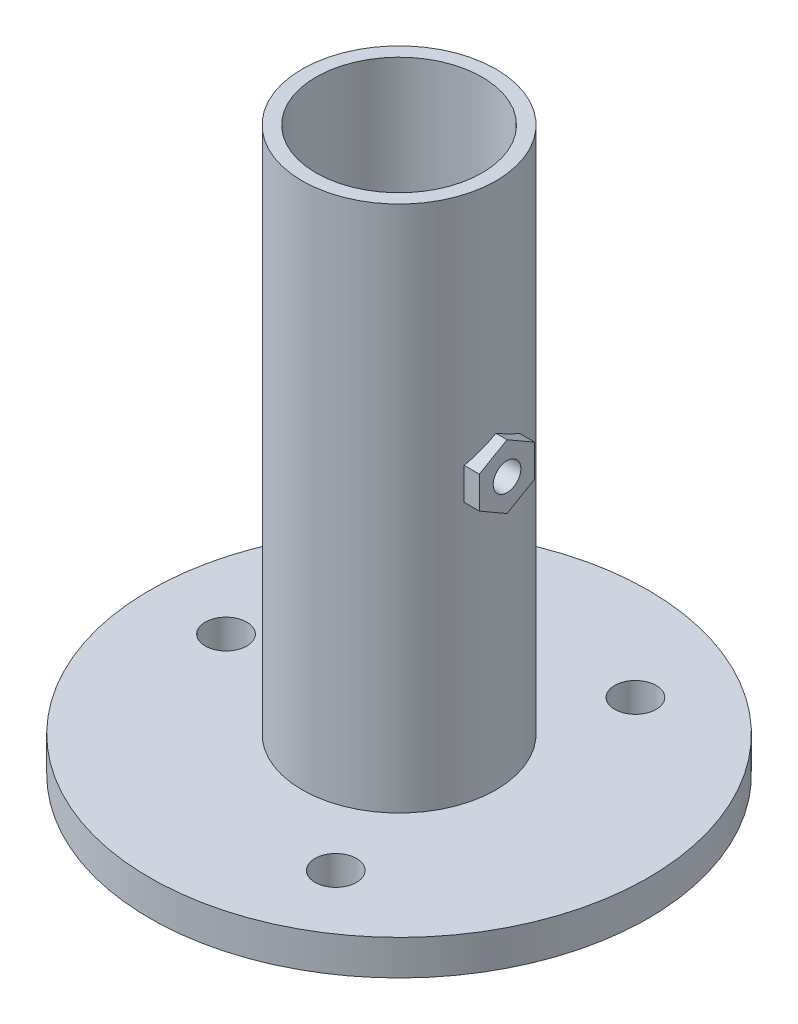
ISO-10303-21;
HEADER;
FILE_DESCRIPTION(('STEP AP214'),'2;1');
FILE_NAME('part.step','',(''),(''),'','','');
FILE_SCHEMA(('AUTOMOTIVE_DESIGN { 1 0 10303 214 1 1 1 1 }'));
ENDSEC;
DATA;
#1=APPLICATION_CONTEXT('core data for automotive mechanical design processes');
#2=APPLICATION_PROTOCOL_DEFINITION('international standard','automotive_design',2000,#1);
#3=PRODUCT_CONTEXT('',#1,'mechanical');
#4=PRODUCT('Part','Part','',(#3));
#5=PRODUCT_RELATED_PRODUCT_CATEGORY('part','',(#4));
#6=PRODUCT_DEFINITION_FORMATION('','',#4);
#7=PRODUCT_DEFINITION_CONTEXT('part definition',#1,'design');
#8=PRODUCT_DEFINITION('design','',#6,#7);
#9=PRODUCT_DEFINITION_SHAPE('','',#8);
#10=(LENGTH_UNIT() NAMED_UNIT(*) SI_UNIT(.MILLI.,.METRE.));
#11=(NAMED_UNIT(*) PLANE_ANGLE_UNIT() SI_UNIT($,.RADIAN.));
#12=(NAMED_UNIT(*) SI_UNIT($,.STERADIAN.) SOLID_ANGLE_UNIT());
#13=UNCERTAINTY_MEASURE_WITH_UNIT(LENGTH_MEASURE(1.E-05),#10,'distance_accuracy_value','');
#14=(GEOMETRIC_REPRESENTATION_CONTEXT(3) GLOBAL_UNCERTAINTY_ASSIGNED_CONTEXT((#13)) GLOBAL_UNIT_ASSIGNED_CONTEXT((#10,
#11,#12)) REPRESENTATION_CONTEXT('',''));
#15=CARTESIAN_POINT('',(0.,0.,0.));
#16=DIRECTION('',(0.,0.,1.));
#17=DIRECTION('',(1.,0.,0.));
#18=AXIS2_PLACEMENT_3D('',#15,#16,#17);
#19=CARTESIAN_POINT('',(0.,101.6,0.));
#20=DIRECTION('',(0.,-1.,0.));
#21=DIRECTION('',(0.,0.,-1.));
#22=AXIS2_PLACEMENT_3D('',#19,#20,#21);
#23=CYLINDRICAL_SURFACE('',#22,17.5);
#24=CARTESIAN_POINT('',(0.,62.1235026918963,0.));
#25=DIRECTION('',(0.,0.866025403784437,-0.500000000000003));
#26=DIRECTION('',(0.,-0.500000000000003,-0.866025403784437));
#27=AXIS2_PLACEMENT_3D('',#24,#25,#26);
#28=ELLIPSE('',#27,20.207259421637,17.5);
#29=CARTESIAN_POINT('',(17.5,62.1235026918963,0.));
#30=VERTEX_POINT('',#29);
#31=CARTESIAN_POINT('',(16.7705098312484,59.2367513459481,-5.00000000000001));
#32=VERTEX_POINT('',#31);
#33=EDGE_CURVE('E213',#30,#32,#28,.T.);
#34=ORIENTED_EDGE('',*,*,#33,.T.);
#35=DIRECTION('',(0.,-1.,0.));
#36=VECTOR('',#35,1.);
#37=CARTESIAN_POINT('',(16.7705098312484,101.6,-5.00000000000016));
#38=LINE('',#37,#36);
#39=CARTESIAN_POINT('',(16.7705098312484,53.4632486540519,-4.99999999999999));
#40=VERTEX_POINT('',#39);
#41=EDGE_CURVE('E216',#32,#40,#38,.T.);
#42=ORIENTED_EDGE('',*,*,#41,.T.);
#43=CARTESIAN_POINT('',(0.,50.5764973081038,0.));
#44=DIRECTION('',(0.,-0.86602540378444,-0.499999999999997));
#45=DIRECTION('',(0.,-0.499999999999997,0.86602540378444));
#46=AXIS2_PLACEMENT_3D('',#43,#44,#45);
#47=ELLIPSE('',#46,20.2072594216369,17.5);
#48=CARTESIAN_POINT('',(17.5,50.5764973081038,0.));
#49=VERTEX_POINT('',#48);
#50=EDGE_CURVE('E186',#40,#49,#47,.T.);
#51=ORIENTED_EDGE('',*,*,#50,.T.);
#52=CARTESIAN_POINT('',(0.,50.5764973081037,0.));
#53=DIRECTION('',(0.,-0.866025403784437,0.500000000000003));
#54=DIRECTION('',(0.,-0.500000000000003,-0.866025403784437));
#55=AXIS2_PLACEMENT_3D('',#52,#53,#54);
#56=ELLIPSE('',#55,20.2072594216369,17.5);
#57=CARTESIAN_POINT('',(16.7705098312484,53.4632486540519,5.));
#58=VERTEX_POINT('',#57);
#59=EDGE_CURVE('E204',#49,#58,#56,.T.);
#60=ORIENTED_EDGE('',*,*,#59,.T.);
#61=DIRECTION('',(0.,-1.,0.));
#62=VECTOR('',#61,1.);
#63=CARTESIAN_POINT('',(16.7705098312485,101.6,4.99999999999982));
#64=LINE('',#63,#62);
#65=CARTESIAN_POINT('',(16.7705098312485,59.2367513459482,4.99999999999998));
#66=VERTEX_POINT('',#65);
#67=EDGE_CURVE('E207',#58,#66,#64,.F.);
#68=ORIENTED_EDGE('',*,*,#67,.T.);
#69=CARTESIAN_POINT('',(0.,62.1235026918963,0.));
#70=DIRECTION('',(0.,0.86602540378444,0.499999999999997));
#71=DIRECTION('',(0.,-0.499999999999997,0.86602540378444));
#72=AXIS2_PLACEMENT_3D('',#69,#70,#71);
#73=ELLIPSE('',#72,20.2072594216369,17.5);
#74=EDGE_CURVE('E210',#66,#30,#73,.T.);
#75=ORIENTED_EDGE('',*,*,#74,.T.);
#76=EDGE_LOOP('',(#34,#42,#51,#60,#68,#75));
#77=FACE_BOUND('',#76,.T.);
#78=CARTESIAN_POINT('',(0.,101.6,0.));
#79=DIRECTION('',(0.,1.,0.));
#80=DIRECTION('',(0.,0.,1.));
#81=AXIS2_PLACEMENT_3D('',#78,#79,#80);
#82=CIRCLE('',#81,17.5);
#83=CARTESIAN_POINT('',(0.,101.6,17.5));
#84=VERTEX_POINT('',#83);
#85=EDGE_CURVE('E233',#84,#84,#82,.T.);
#86=ORIENTED_EDGE('',*,*,#85,.F.);
#87=EDGE_LOOP('',(#86));
#88=FACE_BOUND('',#87,.T.);
#89=CARTESIAN_POINT('',(0.,6.34999999999999,0.));
#90=DIRECTION('',(0.,-1.,0.));
#91=DIRECTION('',(0.,0.,-1.));
#92=AXIS2_PLACEMENT_3D('',#89,#90,#91);
#93=CIRCLE('',#92,17.5);
#94=CARTESIAN_POINT('',(0.,6.34999999999999,-17.5));
#95=VERTEX_POINT('',#94);
#96=EDGE_CURVE('E238',#95,#95,#93,.T.);
#97=ORIENTED_EDGE('',*,*,#96,.F.);
#98=EDGE_LOOP('',(#97));
#99=FACE_BOUND('',#98,.T.);
#100=ADVANCED_FACE('F39',(#77,#88,#99),#23,.T.);
#101=CARTESIAN_POINT('',(0.,-42.4264067919965,0.));
#102=DIRECTION('',(0.,1.,0.));
#103=DIRECTION('',(0.,0.,1.));
#104=AXIS2_PLACEMENT_3D('',#101,#102,#103);
#105=CYLINDRICAL_SURFACE('',#104,14.9999999719999);
#106=CARTESIAN_POINT('',(0.,50.5764973081038,0.));
#107=DIRECTION('',(0.,-0.86602540378444,-0.499999999999997));
#108=DIRECTION('',(0.,0.499999999999997,-0.86602540378444));
#109=AXIS2_PLACEMENT_3D('',#106,#107,#108);
#110=ELLIPSE('',#109,17.320508043357,14.9999999719999);
#111=CARTESIAN_POINT('',(14.9999999719999,50.5764973081038,0.));
#112=VERTEX_POINT('',#111);
#113=CARTESIAN_POINT('',(14.1421355940323,53.4632486540519,-4.99999999999999));
#114=VERTEX_POINT('',#113);
#115=EDGE_CURVE('E241',#112,#114,#110,.F.);
#116=ORIENTED_EDGE('',*,*,#115,.T.);
#117=DIRECTION('',(0.,1.,0.));
#118=VECTOR('',#117,1.);
#119=CARTESIAN_POINT('',(14.1421355940324,-42.4264067919965,-4.99999999999964));
#120=LINE('',#119,#118);
#121=CARTESIAN_POINT('',(14.1421355940323,59.2367513459481,-5.00000000000001));
#122=VERTEX_POINT('',#121);
#123=EDGE_CURVE('E12',#114,#122,#120,.T.);
#124=ORIENTED_EDGE('',*,*,#123,.T.);
#125=CARTESIAN_POINT('',(0.,62.1235026918963,0.));
#126=DIRECTION('',(0.,0.866025403784437,-0.500000000000003));
#127=DIRECTION('',(0.,0.500000000000003,0.866025403784437));
#128=AXIS2_PLACEMENT_3D('',#125,#126,#127);
#129=ELLIPSE('',#128,17.320508043357,14.9999999719999);
#130=CARTESIAN_POINT('',(14.9999999719999,62.1235026918963,0.));
#131=VERTEX_POINT('',#130);
#132=EDGE_CURVE('E46',#122,#131,#129,.F.);
#133=ORIENTED_EDGE('',*,*,#132,.T.);
#134=CARTESIAN_POINT('',(0.,62.1235026918963,0.));
#135=DIRECTION('',(0.,0.86602540378444,0.499999999999997));
#136=DIRECTION('',(0.,0.499999999999997,-0.86602540378444));
#137=AXIS2_PLACEMENT_3D('',#134,#135,#136);
#138=ELLIPSE('',#137,17.320508043357,14.9999999719999);
#139=CARTESIAN_POINT('',(14.1421355940322,59.2367513459482,4.99999999999998));
#140=VERTEX_POINT('',#139);
#141=EDGE_CURVE('E251',#131,#140,#138,.F.);
#142=ORIENTED_EDGE('',*,*,#141,.T.);
#143=DIRECTION('',(0.,1.,0.));
#144=VECTOR('',#143,1.);
#145=CARTESIAN_POINT('',(14.1421355940322,-42.4264067919965,5.00000000000038));
#146=LINE('',#145,#144);
#147=CARTESIAN_POINT('',(14.1421355940323,53.4632486540519,5.));
#148=VERTEX_POINT('',#147);
#149=EDGE_CURVE('E248',#140,#148,#146,.F.);
#150=ORIENTED_EDGE('',*,*,#149,.T.);
#151=CARTESIAN_POINT('',(0.,50.5764973081037,0.));
#152=DIRECTION('',(0.,-0.866025403784437,0.500000000000003));
#153=DIRECTION('',(0.,0.500000000000003,0.866025403784437));
#154=AXIS2_PLACEMENT_3D('',#151,#152,#153);
#155=ELLIPSE('',#154,17.320508043357,14.9999999719999);
#156=EDGE_CURVE('E245',#148,#112,#155,.F.);
#157=ORIENTED_EDGE('',*,*,#156,.T.);
#158=EDGE_LOOP('',(#116,#124,#133,#142,#150,#157));
#159=FACE_BOUND('',#158,.T.);
#160=CARTESIAN_POINT('',(0.,5.,0.));
#161=DIRECTION('',(0.,1.,0.));
#162=DIRECTION('',(0.,0.,1.));
#163=AXIS2_PLACEMENT_3D('',#160,#161,#162);
#164=CIRCLE('',#163,14.9999999719999);
#165=CARTESIAN_POINT('',(0.,5.,14.9999999719999));
#166=VERTEX_POINT('',#165);
#167=EDGE_CURVE('E222',#166,#166,#164,.F.);
#168=ORIENTED_EDGE('',*,*,#167,.T.);
#169=EDGE_LOOP('',(#168));
#170=FACE_BOUND('',#169,.T.);
#171=CARTESIAN_POINT('',(0.,101.6,0.));
#172=DIRECTION('',(0.,1.,0.));
#173=DIRECTION('',(0.,0.,1.));
#174=AXIS2_PLACEMENT_3D('',#171,#172,#173);
#175=CIRCLE('',#174,14.9999999719999);
#176=CARTESIAN_POINT('',(0.,101.6,14.9999999719999));
#177=VERTEX_POINT('',#176);
#178=EDGE_CURVE('E219',#177,#177,#175,.T.);
#179=ORIENTED_EDGE('',*,*,#178,.T.);
#180=EDGE_LOOP('',(#179));
#181=FACE_BOUND('',#180,.T.);
#182=ADVANCED_FACE('F255',(#159,#170,#181),#105,.F.);
#183=CARTESIAN_POINT('',(0.,127.055844122716,0.));
#184=DIRECTION('',(0.,-1.,0.));
#185=DIRECTION('',(0.,0.,-1.));
#186=AXIS2_PLACEMENT_3D('',#183,#184,#185);
#187=CYLINDRICAL_SURFACE('',#186,9.);
#188=CARTESIAN_POINT('',(0.,0.,0.));
#189=DIRECTION('',(0.,-1.,0.));
#190=DIRECTION('',(0.,0.,-1.));
#191=AXIS2_PLACEMENT_3D('',#188,#189,#190);
#192=CIRCLE('',#191,9.);
#193=CARTESIAN_POINT('',(0.,0.,-9.));
#194=VERTEX_POINT('',#193);
#195=EDGE_CURVE('E226',#194,#194,#192,.T.);
#196=ORIENTED_EDGE('',*,*,#195,.T.);
#197=EDGE_LOOP('',(#196));
#198=FACE_BOUND('',#197,.T.);
#199=CARTESIAN_POINT('',(0.,5.,0.));
#200=DIRECTION('',(0.,1.,0.));
#201=DIRECTION('',(0.,0.,1.));
#202=AXIS2_PLACEMENT_3D('',#199,#200,#201);
#203=CIRCLE('',#202,9.);
#204=CARTESIAN_POINT('',(0.,5.,9.));
#205=VERTEX_POINT('',#204);
#206=EDGE_CURVE('E225',#205,#205,#203,.F.);
#207=ORIENTED_EDGE('',*,*,#206,.F.);
#208=EDGE_LOOP('',(#207));
#209=FACE_BOUND('',#208,.T.);
#210=ADVANCED_FACE('F289',(#198,#209),#187,.F.);
#211=CARTESIAN_POINT('',(0.,101.6,0.));
#212=DIRECTION('',(0.,1.,0.));
#213=DIRECTION('',(0.,0.,1.));
#214=AXIS2_PLACEMENT_3D('',#211,#212,#213);
#215=PLANE('',#214);
#216=ORIENTED_EDGE('',*,*,#178,.F.);
#217=EDGE_LOOP('',(#216));
#218=FACE_BOUND('',#217,.T.);
#219=ORIENTED_EDGE('',*,*,#85,.T.);
#220=EDGE_LOOP('',(#219));
#221=FACE_BOUND('',#220,.T.);
#222=ADVANCED_FACE('F307',(#218,#221),#215,.T.);
#223=CARTESIAN_POINT('',(0.,6.35,0.));
#224=DIRECTION('',(0.,-1.,0.));
#225=DIRECTION('',(0.,0.,-1.));
#226=AXIS2_PLACEMENT_3D('',#223,#224,#225);
#227=CYLINDRICAL_SURFACE('',#226,45.);
#228=CARTESIAN_POINT('',(0.,6.35,0.));
#229=DIRECTION('',(0.,-1.,0.));
#230=DIRECTION('',(0.,0.,-1.));
#231=AXIS2_PLACEMENT_3D('',#228,#229,#230);
#232=CIRCLE('',#231,45.);
#233=CARTESIAN_POINT('',(0.,6.35,-45.));
#234=VERTEX_POINT('',#233);
#235=EDGE_CURVE('E230',#234,#234,#232,.T.);
#236=ORIENTED_EDGE('',*,*,#235,.T.);
#237=EDGE_LOOP('',(#236));
#238=FACE_BOUND('',#237,.T.);
#239=CARTESIAN_POINT('',(0.,0.,0.));
#240=DIRECTION('',(0.,-1.,0.));
#241=DIRECTION('',(0.,0.,-1.));
#242=AXIS2_PLACEMENT_3D('',#239,#240,#241);
#243=CIRCLE('',#242,45.);
#244=CARTESIAN_POINT('',(0.,0.,-45.));
#245=VERTEX_POINT('',#244);
#246=EDGE_CURVE('E229',#245,#245,#243,.T.);
#247=ORIENTED_EDGE('',*,*,#246,.F.);
#248=EDGE_LOOP('',(#247));
#249=FACE_BOUND('',#248,.T.);
#250=ADVANCED_FACE('F300',(#238,#249),#227,.T.);
#251=CARTESIAN_POINT('',(0.,6.35,0.));
#252=DIRECTION('',(0.,-1.,0.));
#253=DIRECTION('',(0.,0.,-1.));
#254=AXIS2_PLACEMENT_3D('',#251,#252,#253);
#255=PLANE('',#254);
#256=CARTESIAN_POINT('',(15.6250000000001,6.35,-27.0632938682636));
#257=DIRECTION('',(0.,1.,0.));
#258=DIRECTION('',(-0.866025403784436,0.,-0.500000000000004));
#259=AXIS2_PLACEMENT_3D('',#256,#257,#258);
#260=CIRCLE('',#259,3.75);
#261=CARTESIAN_POINT('',(12.3774047358085,6.35,-28.9382938682637));
#262=VERTEX_POINT('',#261);
#263=EDGE_CURVE('E381',#262,#262,#260,.T.);
#264=ORIENTED_EDGE('',*,*,#263,.F.);
#265=EDGE_LOOP('',(#264));
#266=FACE_BOUND('',#265,.T.);
#267=CARTESIAN_POINT('',(15.6249999999998,6.35,27.0632938682639));
#268=DIRECTION('',(0.,1.,0.));
#269=DIRECTION('',(0.866025403784443,0.,-0.499999999999992));
#270=AXIS2_PLACEMENT_3D('',#267,#268,#269);
#271=CIRCLE('',#270,3.75);
#272=CARTESIAN_POINT('',(18.8725952641914,6.35,25.1882938682639));
#273=VERTEX_POINT('',#272);
#274=EDGE_CURVE('E387',#273,#273,#271,.T.);
#275=ORIENTED_EDGE('',*,*,#274,.F.);
#276=EDGE_LOOP('',(#275));
#277=FACE_BOUND('',#276,.T.);
#278=CARTESIAN_POINT('',(-31.25,6.35,0.));
#279=DIRECTION('',(0.,1.,0.));
#280=DIRECTION('',(0.,0.,1.));
#281=AXIS2_PLACEMENT_3D('',#278,#279,#280);
#282=CIRCLE('',#281,3.75);
#283=CARTESIAN_POINT('',(-31.25,6.35,3.75));
#284=VERTEX_POINT('',#283);
#285=EDGE_CURVE('E384',#284,#284,#282,.T.);
#286=ORIENTED_EDGE('',*,*,#285,.F.);
#287=EDGE_LOOP('',(#286));
#288=FACE_BOUND('',#287,.T.);
#289=ORIENTED_EDGE('',*,*,#96,.T.);
#290=EDGE_LOOP('',(#289));
#291=FACE_BOUND('',#290,.T.);
#292=ORIENTED_EDGE('',*,*,#235,.F.);
#293=EDGE_LOOP('',(#292));
#294=FACE_BOUND('',#293,.T.);
#295=ADVANCED_FACE('F296',(#266,#277,#288,#291,#294),#255,.F.);
#296=CARTESIAN_POINT('',(0.,0.,0.));
#297=DIRECTION('',(0.,1.,0.));
#298=DIRECTION('',(0.,0.,1.));
#299=AXIS2_PLACEMENT_3D('',#296,#297,#298);
#300=PLANE('',#299);
#301=CARTESIAN_POINT('',(15.6250000000001,0.,-27.0632938682636));
#302=DIRECTION('',(0.,1.,0.));
#303=DIRECTION('',(-0.866025403784436,0.,-0.500000000000004));
#304=AXIS2_PLACEMENT_3D('',#301,#302,#303);
#305=CIRCLE('',#304,3.75);
#306=CARTESIAN_POINT('',(12.3774047358085,0.,-28.9382938682637));
#307=VERTEX_POINT('',#306);
#308=EDGE_CURVE('E378',#307,#307,#305,.T.);
#309=ORIENTED_EDGE('',*,*,#308,.T.);
#310=EDGE_LOOP('',(#309));
#311=FACE_BOUND('',#310,.T.);
#312=CARTESIAN_POINT('',(15.6249999999998,0.,27.0632938682639));
#313=DIRECTION('',(0.,1.,0.));
#314=DIRECTION('',(0.866025403784443,0.,-0.499999999999992));
#315=AXIS2_PLACEMENT_3D('',#312,#313,#314);
#316=CIRCLE('',#315,3.75);
#317=CARTESIAN_POINT('',(18.8725952641914,0.,25.1882938682639));
#318=VERTEX_POINT('',#317);
#319=EDGE_CURVE('E382',#318,#318,#316,.T.);
#320=ORIENTED_EDGE('',*,*,#319,.T.);
#321=EDGE_LOOP('',(#320));
#322=FACE_BOUND('',#321,.T.);
#323=CARTESIAN_POINT('',(-31.25,0.,0.));
#324=DIRECTION('',(0.,1.,0.));
#325=DIRECTION('',(0.,0.,1.));
#326=AXIS2_PLACEMENT_3D('',#323,#324,#325);
#327=CIRCLE('',#326,3.75);
#328=CARTESIAN_POINT('',(-31.25,0.,3.75));
#329=VERTEX_POINT('',#328);
#330=EDGE_CURVE('E153',#329,#329,#327,.T.);
#331=ORIENTED_EDGE('',*,*,#330,.T.);
#332=EDGE_LOOP('',(#331));
#333=FACE_BOUND('',#332,.T.);
#334=ORIENTED_EDGE('',*,*,#195,.F.);
#335=EDGE_LOOP('',(#334));
#336=FACE_BOUND('',#335,.T.);
#337=ORIENTED_EDGE('',*,*,#246,.T.);
#338=EDGE_LOOP('',(#337));
#339=FACE_BOUND('',#338,.T.);
#340=ADVANCED_FACE('F299',(#311,#322,#333,#336,#339),#300,.F.);
#341=CARTESIAN_POINT('',(0.,5.,0.));
#342=DIRECTION('',(0.,1.,0.));
#343=DIRECTION('',(0.,0.,1.));
#344=AXIS2_PLACEMENT_3D('',#341,#342,#343);
#345=PLANE('',#344);
#346=ORIENTED_EDGE('',*,*,#167,.F.);
#347=EDGE_LOOP('',(#346));
#348=FACE_BOUND('',#347,.T.);
#349=ORIENTED_EDGE('',*,*,#206,.T.);
#350=EDGE_LOOP('',(#349));
#351=FACE_BOUND('',#350,.T.);
#352=ADVANCED_FACE('F279',(#348,#351),#345,.T.);
#353=CARTESIAN_POINT('',(19.5,53.4632486540519,-4.99999999999999));
#354=DIRECTION('',(0.,-0.86602540378444,-0.499999999999997));
#355=DIRECTION('',(0.,0.499999999999997,-0.86602540378444));
#356=AXIS2_PLACEMENT_3D('',#353,#354,#355);
#357=PLANE('',#356);
#358=ORIENTED_EDGE('',*,*,#115,.F.);
#359=DIRECTION('',(-1.,0.,0.));
#360=VECTOR('',#359,1.);
#361=CARTESIAN_POINT('',(19.5,50.5764973081038,0.));
#362=LINE('',#361,#360);
#363=CARTESIAN_POINT('',(12.5,50.5764973081038,0.));
#364=VERTEX_POINT('',#363);
#365=EDGE_CURVE('E138',#112,#364,#362,.T.);
#366=ORIENTED_EDGE('',*,*,#365,.T.);
#367=DIRECTION('',(0.,-0.499999999999997,0.866025403784441));
#368=VECTOR('',#367,1.);
#369=CARTESIAN_POINT('',(12.5,53.4632486540519,-4.99999999999999));
#370=LINE('',#369,#368);
#371=CARTESIAN_POINT('',(12.5,53.4632486540519,-4.99999999999999));
#372=VERTEX_POINT('',#371);
#373=EDGE_CURVE('E135',#372,#364,#370,.T.);
#374=ORIENTED_EDGE('',*,*,#373,.F.);
#375=DIRECTION('',(-1.,0.,0.));
#376=VECTOR('',#375,1.);
#377=CARTESIAN_POINT('',(19.5,53.4632486540519,-4.99999999999999));
#378=LINE('',#377,#376);
#379=EDGE_CURVE('E61',#114,#372,#378,.T.);
#380=ORIENTED_EDGE('',*,*,#379,.F.);
#381=EDGE_LOOP('',(#358,#366,#374,#380));
#382=FACE_BOUND('',#381,.T.);
#383=ADVANCED_FACE('F136',(#382),#357,.T.);
#384=CARTESIAN_POINT('',(19.5,50.5764973081038,0.));
#385=DIRECTION('',(0.,-0.866025403784437,0.500000000000003));
#386=DIRECTION('',(0.,-0.500000000000003,-0.866025403784437));
#387=AXIS2_PLACEMENT_3D('',#384,#385,#386);
#388=PLANE('',#387);
#389=ORIENTED_EDGE('',*,*,#156,.F.);
#390=DIRECTION('',(-1.,0.,0.));
#391=VECTOR('',#390,1.);
#392=CARTESIAN_POINT('',(19.5,53.4632486540519,5.));
#393=LINE('',#392,#391);
#394=CARTESIAN_POINT('',(12.5,53.4632486540519,5.));
#395=VERTEX_POINT('',#394);
#396=EDGE_CURVE('E199',#148,#395,#393,.T.);
#397=ORIENTED_EDGE('',*,*,#396,.T.);
#398=DIRECTION('',(0.,0.500000000000003,0.866025403784437));
#399=VECTOR('',#398,1.);
#400=CARTESIAN_POINT('',(12.5,50.5764973081038,0.));
#401=LINE('',#400,#399);
#402=EDGE_CURVE('E142',#364,#395,#401,.T.);
#403=ORIENTED_EDGE('',*,*,#402,.F.);
#404=ORIENTED_EDGE('',*,*,#365,.F.);
#405=EDGE_LOOP('',(#389,#397,#403,#404));
#406=FACE_BOUND('',#405,.T.);
#407=ADVANCED_FACE('F269',(#406),#388,.T.);
#408=CARTESIAN_POINT('',(19.5,53.4632486540519,5.));
#409=DIRECTION('',(0.,0.,1.));
#410=DIRECTION('',(0.,-1.,0.));
#411=AXIS2_PLACEMENT_3D('',#408,#409,#410);
#412=PLANE('',#411);
#413=ORIENTED_EDGE('',*,*,#149,.F.);
#414=DIRECTION('',(-1.,0.,0.));
#415=VECTOR('',#414,1.);
#416=CARTESIAN_POINT('',(19.5,59.2367513459482,4.99999999999998));
#417=LINE('',#416,#415);
#418=CARTESIAN_POINT('',(12.5,59.2367513459482,4.99999999999998));
#419=VERTEX_POINT('',#418);
#420=EDGE_CURVE('E195',#140,#419,#417,.T.);
#421=ORIENTED_EDGE('',*,*,#420,.T.);
#422=DIRECTION('',(0.,1.,0.));
#423=VECTOR('',#422,1.);
#424=CARTESIAN_POINT('',(12.5,53.4632486540519,5.));
#425=LINE('',#424,#423);
#426=EDGE_CURVE('E158',#395,#419,#425,.T.);
#427=ORIENTED_EDGE('',*,*,#426,.F.);
#428=ORIENTED_EDGE('',*,*,#396,.F.);
#429=EDGE_LOOP('',(#413,#421,#427,#428));
#430=FACE_BOUND('',#429,.T.);
#431=ADVANCED_FACE('F267',(#430),#412,.T.);
#432=CARTESIAN_POINT('',(19.5,59.2367513459482,4.99999999999998));
#433=DIRECTION('',(0.,0.86602540378444,0.499999999999997));
#434=DIRECTION('',(0.,-0.499999999999997,0.86602540378444));
#435=AXIS2_PLACEMENT_3D('',#432,#433,#434);
#436=PLANE('',#435);
#437=ORIENTED_EDGE('',*,*,#141,.F.);
#438=DIRECTION('',(-1.,0.,0.));
#439=VECTOR('',#438,1.);
#440=CARTESIAN_POINT('',(19.5,62.1235026918963,0.));
#441=LINE('',#440,#439);
#442=CARTESIAN_POINT('',(12.5,62.1235026918963,0.));
#443=VERTEX_POINT('',#442);
#444=EDGE_CURVE('E191',#131,#443,#441,.T.);
#445=ORIENTED_EDGE('',*,*,#444,.T.);
#446=DIRECTION('',(0.,0.499999999999997,-0.86602540378444));
#447=VECTOR('',#446,1.);
#448=CARTESIAN_POINT('',(12.5,59.2367513459482,4.99999999999998));
#449=LINE('',#448,#447);
#450=EDGE_CURVE('E161',#419,#443,#449,.T.);
#451=ORIENTED_EDGE('',*,*,#450,.F.);
#452=ORIENTED_EDGE('',*,*,#420,.F.);
#453=EDGE_LOOP('',(#437,#445,#451,#452));
#454=FACE_BOUND('',#453,.T.);
#455=ADVANCED_FACE('F262',(#454),#436,.T.);
#456=CARTESIAN_POINT('',(19.5,62.1235026918963,0.));
#457=DIRECTION('',(0.,0.866025403784437,-0.500000000000003));
#458=DIRECTION('',(0.,0.500000000000003,0.866025403784437));
#459=AXIS2_PLACEMENT_3D('',#456,#457,#458);
#460=PLANE('',#459);
#461=ORIENTED_EDGE('',*,*,#132,.F.);
#462=DIRECTION('',(-1.,0.,0.));
#463=VECTOR('',#462,1.);
#464=CARTESIAN_POINT('',(19.5,59.2367513459481,-5.00000000000001));
#465=LINE('',#464,#463);
#466=CARTESIAN_POINT('',(12.5,59.2367513459481,-5.00000000000001));
#467=VERTEX_POINT('',#466);
#468=EDGE_CURVE('E187',#122,#467,#465,.T.);
#469=ORIENTED_EDGE('',*,*,#468,.T.);
#470=DIRECTION('',(0.,-0.500000000000003,-0.866025403784437));
#471=VECTOR('',#470,1.);
#472=CARTESIAN_POINT('',(12.5,62.1235026918963,0.));
#473=LINE('',#472,#471);
#474=EDGE_CURVE('E149',#443,#467,#473,.T.);
#475=ORIENTED_EDGE('',*,*,#474,.F.);
#476=ORIENTED_EDGE('',*,*,#444,.F.);
#477=EDGE_LOOP('',(#461,#469,#475,#476));
#478=FACE_BOUND('',#477,.T.);
#479=ADVANCED_FACE('F259',(#478),#460,.T.);
#480=CARTESIAN_POINT('',(19.5,59.2367513459481,-5.00000000000001));
#481=DIRECTION('',(0.,0.,-1.));
#482=DIRECTION('',(0.,1.,0.));
#483=AXIS2_PLACEMENT_3D('',#480,#481,#482);
#484=PLANE('',#483);
#485=ORIENTED_EDGE('',*,*,#123,.F.);
#486=ORIENTED_EDGE('',*,*,#379,.T.);
#487=DIRECTION('',(0.,-1.,0.));
#488=VECTOR('',#487,1.);
#489=CARTESIAN_POINT('',(12.5,59.2367513459481,-5.00000000000001));
#490=LINE('',#489,#488);
#491=EDGE_CURVE('E129',#467,#372,#490,.T.);
#492=ORIENTED_EDGE('',*,*,#491,.F.);
#493=ORIENTED_EDGE('',*,*,#468,.F.);
#494=EDGE_LOOP('',(#485,#486,#492,#493));
#495=FACE_BOUND('',#494,.T.);
#496=ADVANCED_FACE('F126',(#495),#484,.T.);
#497=CARTESIAN_POINT('',(12.5,0.,0.));
#498=DIRECTION('',(-1.,0.,0.));
#499=DIRECTION('',(0.,0.,1.));
#500=AXIS2_PLACEMENT_3D('',#497,#498,#499);
#501=PLANE('',#500);
#502=ORIENTED_EDGE('',*,*,#491,.T.);
#503=ORIENTED_EDGE('',*,*,#373,.T.);
#504=ORIENTED_EDGE('',*,*,#402,.T.);
#505=ORIENTED_EDGE('',*,*,#426,.T.);
#506=ORIENTED_EDGE('',*,*,#450,.T.);
#507=ORIENTED_EDGE('',*,*,#474,.T.);
#508=EDGE_LOOP('',(#502,#503,#504,#505,#506,#507));
#509=FACE_BOUND('',#508,.T.);
#510=CARTESIAN_POINT('',(12.5,56.35,0.));
#511=DIRECTION('',(-1.,0.,0.));
#512=DIRECTION('',(0.,0.,1.));
#513=AXIS2_PLACEMENT_3D('',#510,#511,#512);
#514=CIRCLE('',#513,2.5);
#515=CARTESIAN_POINT('',(12.5,56.35,2.5));
#516=VERTEX_POINT('',#515);
#517=EDGE_CURVE('E150',#516,#516,#514,.T.);
#518=ORIENTED_EDGE('',*,*,#517,.F.);
#519=EDGE_LOOP('',(#518));
#520=FACE_BOUND('',#519,.T.);
#521=ADVANCED_FACE('F145',(#509,#520),#501,.T.);
#522=ORIENTED_EDGE('',*,*,#41,.F.);
#523=CARTESIAN_POINT('',(19.5,59.2367513459481,-5.00000000000001));
#524=VERTEX_POINT('',#523);
#525=EDGE_CURVE('E183',#524,#32,#465,.T.);
#526=ORIENTED_EDGE('',*,*,#525,.F.);
#527=DIRECTION('',(0.,-1.,0.));
#528=VECTOR('',#527,1.);
#529=CARTESIAN_POINT('',(19.5,59.2367513459481,-5.00000000000001));
#530=LINE('',#529,#528);
#531=CARTESIAN_POINT('',(19.5,53.4632486540519,-4.99999999999999));
#532=VERTEX_POINT('',#531);
#533=EDGE_CURVE('E167',#524,#532,#530,.T.);
#534=ORIENTED_EDGE('',*,*,#533,.T.);
#535=EDGE_CURVE('E131',#532,#40,#378,.T.);
#536=ORIENTED_EDGE('',*,*,#535,.T.);
#537=EDGE_LOOP('',(#522,#526,#534,#536));
#538=FACE_BOUND('',#537,.T.);
#539=ADVANCED_FACE('F333',(#538),#484,.T.);
#540=ORIENTED_EDGE('',*,*,#33,.F.);
#541=CARTESIAN_POINT('',(19.5,62.1235026918963,0.));
#542=VERTEX_POINT('',#541);
#543=EDGE_CURVE('E188',#542,#30,#441,.T.);
#544=ORIENTED_EDGE('',*,*,#543,.F.);
#545=DIRECTION('',(0.,-0.500000000000003,-0.866025403784437));
#546=VECTOR('',#545,1.);
#547=CARTESIAN_POINT('',(19.5,62.1235026918963,0.));
#548=LINE('',#547,#546);
#549=EDGE_CURVE('E132',#542,#524,#548,.T.);
#550=ORIENTED_EDGE('',*,*,#549,.T.);
#551=ORIENTED_EDGE('',*,*,#525,.T.);
#552=EDGE_LOOP('',(#540,#544,#550,#551));
#553=FACE_BOUND('',#552,.T.);
#554=ADVANCED_FACE('F335',(#553),#460,.T.);
#555=ORIENTED_EDGE('',*,*,#74,.F.);
#556=CARTESIAN_POINT('',(19.5,59.2367513459482,4.99999999999998));
#557=VERTEX_POINT('',#556);
#558=EDGE_CURVE('E192',#557,#66,#417,.T.);
#559=ORIENTED_EDGE('',*,*,#558,.F.);
#560=DIRECTION('',(0.,0.499999999999997,-0.86602540378444));
#561=VECTOR('',#560,1.);
#562=CARTESIAN_POINT('',(19.5,59.2367513459482,4.99999999999998));
#563=LINE('',#562,#561);
#564=EDGE_CURVE('E178',#557,#542,#563,.T.);
#565=ORIENTED_EDGE('',*,*,#564,.T.);
#566=ORIENTED_EDGE('',*,*,#543,.T.);
#567=EDGE_LOOP('',(#555,#559,#565,#566));
#568=FACE_BOUND('',#567,.T.);
#569=ADVANCED_FACE('F351',(#568),#436,.T.);
#570=ORIENTED_EDGE('',*,*,#67,.F.);
#571=CARTESIAN_POINT('',(19.5,53.4632486540519,5.));
#572=VERTEX_POINT('',#571);
#573=EDGE_CURVE('E196',#572,#58,#393,.T.);
#574=ORIENTED_EDGE('',*,*,#573,.F.);
#575=DIRECTION('',(0.,1.,0.));
#576=VECTOR('',#575,1.);
#577=CARTESIAN_POINT('',(19.5,53.4632486540519,5.));
#578=LINE('',#577,#576);
#579=EDGE_CURVE('E175',#572,#557,#578,.T.);
#580=ORIENTED_EDGE('',*,*,#579,.T.);
#581=ORIENTED_EDGE('',*,*,#558,.T.);
#582=EDGE_LOOP('',(#570,#574,#580,#581));
#583=FACE_BOUND('',#582,.T.);
#584=ADVANCED_FACE('F278',(#583),#412,.T.);
#585=ORIENTED_EDGE('',*,*,#59,.F.);
#586=CARTESIAN_POINT('',(19.5,50.5764973081038,0.));
#587=VERTEX_POINT('',#586);
#588=EDGE_CURVE('E53',#587,#49,#362,.T.);
#589=ORIENTED_EDGE('',*,*,#588,.F.);
#590=DIRECTION('',(0.,0.500000000000003,0.866025403784437));
#591=VECTOR('',#590,1.);
#592=CARTESIAN_POINT('',(19.5,50.5764973081038,0.));
#593=LINE('',#592,#591);
#594=EDGE_CURVE('E172',#587,#572,#593,.T.);
#595=ORIENTED_EDGE('',*,*,#594,.T.);
#596=ORIENTED_EDGE('',*,*,#573,.T.);
#597=EDGE_LOOP('',(#585,#589,#595,#596));
#598=FACE_BOUND('',#597,.T.);
#599=ADVANCED_FACE('F272',(#598),#388,.T.);
#600=ORIENTED_EDGE('',*,*,#50,.F.);
#601=ORIENTED_EDGE('',*,*,#535,.F.);
#602=DIRECTION('',(0.,-0.499999999999997,0.866025403784441));
#603=VECTOR('',#602,1.);
#604=CARTESIAN_POINT('',(19.5,53.4632486540519,-4.99999999999999));
#605=LINE('',#604,#603);
#606=EDGE_CURVE('E170',#532,#587,#605,.T.);
#607=ORIENTED_EDGE('',*,*,#606,.T.);
#608=ORIENTED_EDGE('',*,*,#588,.T.);
#609=EDGE_LOOP('',(#600,#601,#607,#608));
#610=FACE_BOUND('',#609,.T.);
#611=ADVANCED_FACE('F281',(#610),#357,.T.);
#612=CARTESIAN_POINT('',(19.5,0.,0.));
#613=DIRECTION('',(-1.,0.,0.));
#614=DIRECTION('',(0.,0.,1.));
#615=AXIS2_PLACEMENT_3D('',#612,#613,#614);
#616=PLANE('',#615);
#617=CARTESIAN_POINT('',(19.5,56.35,0.));
#618=DIRECTION('',(-1.,0.,0.));
#619=DIRECTION('',(0.,0.,1.));
#620=AXIS2_PLACEMENT_3D('',#617,#618,#619);
#621=CIRCLE('',#620,2.5);
#622=CARTESIAN_POINT('',(19.5,56.35,2.5));
#623=VERTEX_POINT('',#622);
#624=EDGE_CURVE('E164',#623,#623,#621,.T.);
#625=ORIENTED_EDGE('',*,*,#624,.T.);
#626=EDGE_LOOP('',(#625));
#627=FACE_BOUND('',#626,.T.);
#628=ORIENTED_EDGE('',*,*,#533,.F.);
#629=ORIENTED_EDGE('',*,*,#549,.F.);
#630=ORIENTED_EDGE('',*,*,#564,.F.);
#631=ORIENTED_EDGE('',*,*,#579,.F.);
#632=ORIENTED_EDGE('',*,*,#594,.F.);
#633=ORIENTED_EDGE('',*,*,#606,.F.);
#634=EDGE_LOOP('',(#628,#629,#630,#631,#632,#633));
#635=FACE_BOUND('',#634,.T.);
#636=ADVANCED_FACE('F331',(#627,#635),#616,.F.);
#637=CARTESIAN_POINT('',(45.,56.35,0.));
#638=DIRECTION('',(-1.,0.,0.));
#639=DIRECTION('',(0.,0.,1.));
#640=AXIS2_PLACEMENT_3D('',#637,#638,#639);
#641=CYLINDRICAL_SURFACE('',#640,2.5);
#642=CARTESIAN_POINT('',(12.5,56.35,2.5));
#643=CARTESIAN_POINT('',(12.5729166666667,56.35,2.5));
#644=CARTESIAN_POINT('',(12.6458333333333,56.35,2.5));
#645=CARTESIAN_POINT('',(12.7916666666667,56.35,2.5));
#646=CARTESIAN_POINT('',(12.8645833333333,56.35,2.5));
#647=CARTESIAN_POINT('',(13.0104166666667,56.35,2.5));
#648=CARTESIAN_POINT('',(13.0833333333333,56.35,2.5));
#649=CARTESIAN_POINT('',(13.2291666666667,56.35,2.5));
#650=CARTESIAN_POINT('',(13.3020833333333,56.35,2.5));
#651=CARTESIAN_POINT('',(13.4479166666667,56.35,2.5));
#652=CARTESIAN_POINT('',(13.5208333333333,56.35,2.5));
#653=CARTESIAN_POINT('',(13.6666666666667,56.35,2.5));
#654=CARTESIAN_POINT('',(13.7395833333333,56.35,2.5));
#655=CARTESIAN_POINT('',(13.8854166666667,56.35,2.5));
#656=CARTESIAN_POINT('',(13.9583333333333,56.35,2.5));
#657=CARTESIAN_POINT('',(14.1041666666667,56.35,2.5));
#658=CARTESIAN_POINT('',(14.1770833333333,56.35,2.5));
#659=CARTESIAN_POINT('',(14.3229166666667,56.35,2.5));
#660=CARTESIAN_POINT('',(14.3958333333333,56.35,2.5));
#661=CARTESIAN_POINT('',(14.5416666666667,56.35,2.5));
#662=CARTESIAN_POINT('',(14.6145833333333,56.35,2.5));
#663=CARTESIAN_POINT('',(14.7604166666667,56.35,2.5));
#664=CARTESIAN_POINT('',(14.8333333333333,56.35,2.5));
#665=CARTESIAN_POINT('',(14.9791666666667,56.35,2.5));
#666=CARTESIAN_POINT('',(15.0520833333333,56.35,2.5));
#667=CARTESIAN_POINT('',(15.1979166666667,56.35,2.5));
#668=CARTESIAN_POINT('',(15.2708333333333,56.35,2.5));
#669=CARTESIAN_POINT('',(15.4166666666667,56.35,2.5));
#670=CARTESIAN_POINT('',(15.4895833333333,56.35,2.5));
#671=CARTESIAN_POINT('',(15.6354166666667,56.35,2.5));
#672=CARTESIAN_POINT('',(15.7083333333333,56.35,2.5));
#673=CARTESIAN_POINT('',(15.8541666666667,56.35,2.5));
#674=CARTESIAN_POINT('',(15.9270833333333,56.35,2.5));
#675=CARTESIAN_POINT('',(16.0729166666667,56.35,2.5));
#676=CARTESIAN_POINT('',(16.1458333333333,56.35,2.5));
#677=CARTESIAN_POINT('',(16.2916666666667,56.35,2.5));
#678=CARTESIAN_POINT('',(16.3645833333333,56.35,2.5));
#679=CARTESIAN_POINT('',(16.5104166666667,56.35,2.5));
#680=CARTESIAN_POINT('',(16.5833333333333,56.35,2.5));
#681=CARTESIAN_POINT('',(16.7291666666667,56.35,2.5));
#682=CARTESIAN_POINT('',(16.8020833333333,56.35,2.5));
#683=CARTESIAN_POINT('',(16.9479166666667,56.35,2.5));
#684=CARTESIAN_POINT('',(17.0208333333333,56.35,2.5));
#685=CARTESIAN_POINT('',(17.1666666666667,56.35,2.5));
#686=CARTESIAN_POINT('',(17.2395833333333,56.35,2.5));
#687=CARTESIAN_POINT('',(17.3854166666667,56.35,2.5));
#688=CARTESIAN_POINT('',(17.4583333333333,56.35,2.5));
#689=CARTESIAN_POINT('',(17.6041666666667,56.35,2.5));
#690=CARTESIAN_POINT('',(17.6770833333333,56.35,2.5));
#691=CARTESIAN_POINT('',(17.8229166666667,56.35,2.5));
#692=CARTESIAN_POINT('',(17.8958333333333,56.35,2.5));
#693=CARTESIAN_POINT('',(18.0416666666667,56.35,2.5));
#694=CARTESIAN_POINT('',(18.1145833333333,56.35,2.5));
#695=CARTESIAN_POINT('',(18.2604166666667,56.35,2.5));
#696=CARTESIAN_POINT('',(18.3333333333333,56.35,2.5));
#697=CARTESIAN_POINT('',(18.4791666666667,56.35,2.5));
#698=CARTESIAN_POINT('',(18.5520833333333,56.35,2.5));
#699=CARTESIAN_POINT('',(18.6979166666667,56.35,2.5));
#700=CARTESIAN_POINT('',(18.7708333333333,56.35,2.5));
#701=CARTESIAN_POINT('',(18.9166666666667,56.35,2.5));
#702=CARTESIAN_POINT('',(18.9895833333333,56.35,2.5));
#703=CARTESIAN_POINT('',(19.1354166666667,56.35,2.5));
#704=CARTESIAN_POINT('',(19.2083333333333,56.35,2.5));
#705=CARTESIAN_POINT('',(19.3541666666667,56.35,2.5));
#706=CARTESIAN_POINT('',(19.4270833333333,56.35,2.5));
#707=CARTESIAN_POINT('',(19.5,56.35,2.5));
#708=B_SPLINE_CURVE_WITH_KNOTS('',3,(#642,#643,#644,#645,#646,#647,#648,#649,#650,#651,#652,
#653,#654,#655,#656,#657,#658,#659,#660,#661,#662,#663,#664,#665,#666,#667,#668,#669,#670,#671,
#672,#673,#674,#675,#676,#677,#678,#679,#680,#681,#682,#683,#684,#685,#686,#687,#688,#689,#690,
#691,#692,#693,#694,#695,#696,#697,#698,#699,#700,#701,#702,#703,#704,#705,#706,#707),
.UNSPECIFIED.,.F.,.F.,(4,2,2,2,2,2,2,2,2,2,2,2,2,2,2,2,2,2,2,2,2,2,2,2,2,2,2,2,2,2,2,2,4),(0.,
0.218749999999997,0.4375,0.656249999999997,0.875000000000001,1.09375,1.3125,1.53125,1.75,
1.96874999999999,2.1875,2.40625,2.625,2.84375,3.0625,3.28125,3.5,3.71875,3.9375,4.15625,4.375,
4.59375,4.81249999999999,5.03125,5.24999999999999,5.46875,5.68749999999999,5.90624999999999,
6.12499999999999,6.34375,6.5625,6.78125,7.),.UNSPECIFIED.);
#709=EDGE_CURVE('BSEAM327',#516,#623,#708,.T.);
#710=ORIENTED_EDGE('',*,*,#517,.T.);
#711=ORIENTED_EDGE('',*,*,#624,.F.);
#712=ORIENTED_EDGE('',*,*,#709,.T.);
#713=ORIENTED_EDGE('',*,*,#709,.F.);
#714=EDGE_LOOP('',(#710,#712,#711,#713));
#715=FACE_BOUND('',#714,.T.);
#716=ADVANCED_FACE('F327',(#715),#641,.F.);
#717=CARTESIAN_POINT('',(-31.25,0.,0.));
#718=DIRECTION('',(0.,1.,0.));
#719=DIRECTION('',(0.,0.,1.));
#720=AXIS2_PLACEMENT_3D('',#717,#718,#719);
#721=CYLINDRICAL_SURFACE('',#720,3.75);
#722=ORIENTED_EDGE('',*,*,#330,.F.);
#723=EDGE_LOOP('',(#722));
#724=FACE_BOUND('',#723,.T.);
#725=ORIENTED_EDGE('',*,*,#285,.T.);
#726=EDGE_LOOP('',(#725));
#727=FACE_BOUND('',#726,.T.);
#728=ADVANCED_FACE('F330',(#724,#727),#721,.F.);
#729=CARTESIAN_POINT('',(15.6249999999998,0.,27.0632938682639));
#730=DIRECTION('',(0.,1.,0.));
#731=DIRECTION('',(0.,0.,1.));
#732=AXIS2_PLACEMENT_3D('',#729,#730,#731);
#733=CYLINDRICAL_SURFACE('',#732,3.75);
#734=ORIENTED_EDGE('',*,*,#319,.F.);
#735=EDGE_LOOP('',(#734));
#736=FACE_BOUND('',#735,.T.);
#737=ORIENTED_EDGE('',*,*,#274,.T.);
#738=EDGE_LOOP('',(#737));
#739=FACE_BOUND('',#738,.T.);
#740=ADVANCED_FACE('F366',(#736,#739),#733,.F.);
#741=CARTESIAN_POINT('',(15.6250000000001,0.,-27.0632938682636));
#742=DIRECTION('',(0.,1.,0.));
#743=DIRECTION('',(0.,0.,1.));
#744=AXIS2_PLACEMENT_3D('',#741,#742,#743);
#745=CYLINDRICAL_SURFACE('',#744,3.75);
#746=ORIENTED_EDGE('',*,*,#308,.F.);
#747=EDGE_LOOP('',(#746));
#748=FACE_BOUND('',#747,.T.);
#749=ORIENTED_EDGE('',*,*,#263,.T.);
#750=EDGE_LOOP('',(#749));
#751=FACE_BOUND('',#750,.T.);
#752=ADVANCED_FACE('F370',(#748,#751),#745,.F.);
#753=CLOSED_SHELL('',(#100,#182,#210,#222,#250,#295,#340,#352,#383,#407,#431,#455,#479,#496,
#521,#539,#554,#569,#584,#599,#611,#636,#716,#728,#740,#752));
#754=MANIFOLD_SOLID_BREP('B2',#753);
#755=ADVANCED_BREP_SHAPE_REPRESENTATION('',(#18,#754),#14);
#756=SHAPE_DEFINITION_REPRESENTATION(#9,#755);
ENDSEC;
END-ISO-10303-21;
